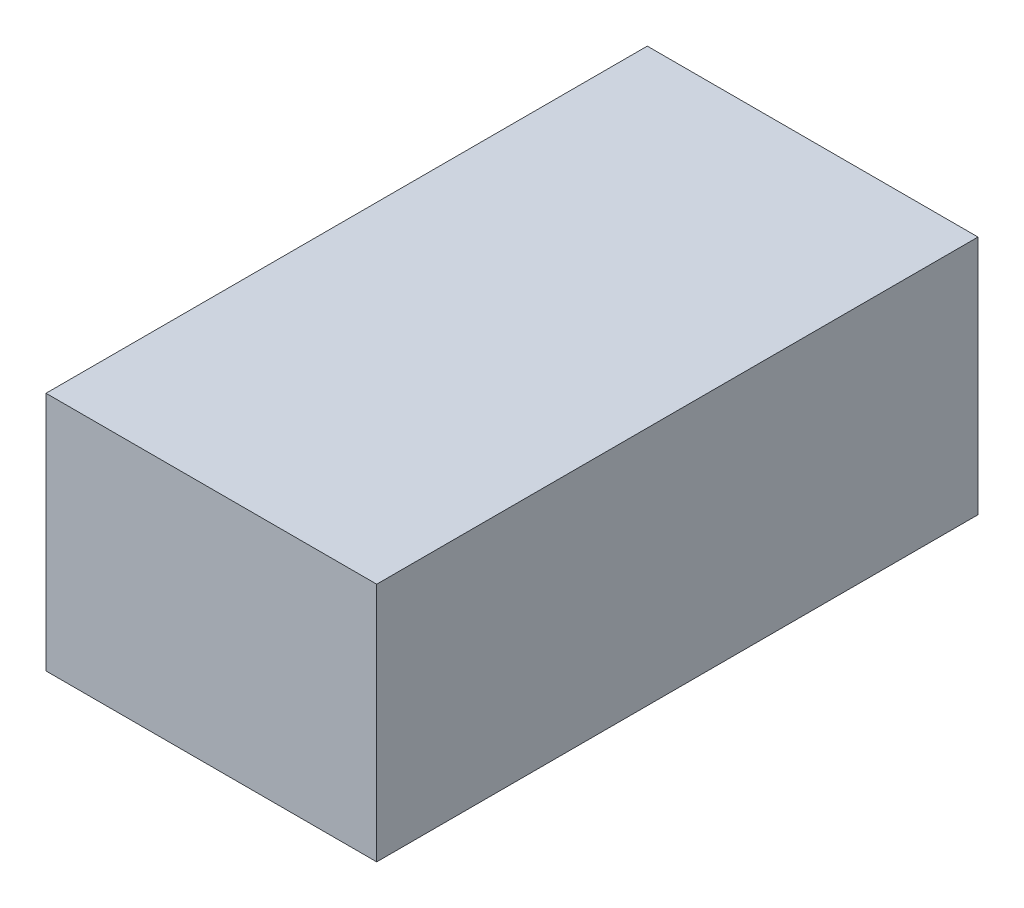
ISO-10303-21;
HEADER;
FILE_DESCRIPTION(('STEP AP214'),'2;1');
FILE_NAME('part.step','',(''),(''),'','','');
FILE_SCHEMA(('AUTOMOTIVE_DESIGN { 1 0 10303 214 1 1 1 1 }'));
ENDSEC;
DATA;
#1=APPLICATION_CONTEXT('core data for automotive mechanical design processes');
#2=APPLICATION_PROTOCOL_DEFINITION('international standard','automotive_design',2000,#1);
#3=PRODUCT_CONTEXT('',#1,'mechanical');
#4=PRODUCT('Part','Part','',(#3));
#5=PRODUCT_RELATED_PRODUCT_CATEGORY('part','',(#4));
#6=PRODUCT_DEFINITION_FORMATION('','',#4);
#7=PRODUCT_DEFINITION_CONTEXT('part definition',#1,'design');
#8=PRODUCT_DEFINITION('design','',#6,#7);
#9=PRODUCT_DEFINITION_SHAPE('','',#8);
#10=(LENGTH_UNIT() NAMED_UNIT(*) SI_UNIT(.MILLI.,.METRE.));
#11=(NAMED_UNIT(*) PLANE_ANGLE_UNIT() SI_UNIT($,.RADIAN.));
#12=(NAMED_UNIT(*) SI_UNIT($,.STERADIAN.) SOLID_ANGLE_UNIT());
#13=UNCERTAINTY_MEASURE_WITH_UNIT(LENGTH_MEASURE(1.E-05),#10,'distance_accuracy_value','');
#14=(GEOMETRIC_REPRESENTATION_CONTEXT(3) GLOBAL_UNCERTAINTY_ASSIGNED_CONTEXT((#13)) GLOBAL_UNIT_ASSIGNED_CONTEXT((#10,
#11,#12)) REPRESENTATION_CONTEXT('',''));
#15=CARTESIAN_POINT('',(0.,0.,0.));
#16=DIRECTION('',(0.,0.,1.));
#17=DIRECTION('',(1.,0.,0.));
#18=AXIS2_PLACEMENT_3D('',#15,#16,#17);
#19=CARTESIAN_POINT('',(-5.5,6.,10.));
#20=DIRECTION('',(1.,0.,0.));
#21=DIRECTION('',(0.,1.,0.));
#22=AXIS2_PLACEMENT_3D('',#19,#20,#21);
#23=PLANE('',#22);
#24=DIRECTION('',(0.,-1.,0.));
#25=VECTOR('',#24,1.);
#26=CARTESIAN_POINT('',(-5.5,6.,-10.));
#27=LINE('',#26,#25);
#28=CARTESIAN_POINT('',(-5.5,6.,-10.));
#29=VERTEX_POINT('',#28);
#30=CARTESIAN_POINT('',(-5.5,-2.,-10.));
#31=VERTEX_POINT('',#30);
#32=EDGE_CURVE('E104',#29,#31,#27,.T.);
#33=ORIENTED_EDGE('',*,*,#32,.T.);
#34=DIRECTION('',(0.,0.,-1.));
#35=VECTOR('',#34,1.);
#36=CARTESIAN_POINT('',(-5.5,-2.,10.));
#37=LINE('',#36,#35);
#38=CARTESIAN_POINT('',(-5.5,-2.,10.));
#39=VERTEX_POINT('',#38);
#40=EDGE_CURVE('E46',#39,#31,#37,.T.);
#41=ORIENTED_EDGE('',*,*,#40,.F.);
#42=DIRECTION('',(0.,-1.,0.));
#43=VECTOR('',#42,1.);
#44=CARTESIAN_POINT('',(-5.5,6.,10.));
#45=LINE('',#44,#43);
#46=CARTESIAN_POINT('',(-5.5,6.,10.));
#47=VERTEX_POINT('',#46);
#48=EDGE_CURVE('E88',#47,#39,#45,.T.);
#49=ORIENTED_EDGE('',*,*,#48,.F.);
#50=DIRECTION('',(0.,0.,-1.));
#51=VECTOR('',#50,1.);
#52=CARTESIAN_POINT('',(-5.5,6.,10.));
#53=LINE('',#52,#51);
#54=EDGE_CURVE('E54',#47,#29,#53,.T.);
#55=ORIENTED_EDGE('',*,*,#54,.T.);
#56=EDGE_LOOP('',(#33,#41,#49,#55));
#57=FACE_BOUND('',#56,.T.);
#58=ADVANCED_FACE('F37',(#57),#23,.F.);
#59=CARTESIAN_POINT('',(-5.5,-2.,10.));
#60=DIRECTION('',(0.,1.,0.));
#61=DIRECTION('',(-1.,0.,0.));
#62=AXIS2_PLACEMENT_3D('',#59,#60,#61);
#63=PLANE('',#62);
#64=CARTESIAN_POINT('',(0.,-2.,0.));
#65=DIRECTION('',(0.,1.,0.));
#66=DIRECTION('',(0.,0.,1.));
#67=AXIS2_PLACEMENT_3D('',#64,#65,#66);
#68=CIRCLE('',#67,2.5);
#69=CARTESIAN_POINT('',(0.,-2.,2.5));
#70=VERTEX_POINT('',#69);
#71=EDGE_CURVE('E122',#70,#70,#68,.T.);
#72=ORIENTED_EDGE('',*,*,#71,.T.);
#73=EDGE_LOOP('',(#72));
#74=FACE_BOUND('',#73,.T.);
#75=DIRECTION('',(1.,0.,0.));
#76=VECTOR('',#75,1.);
#77=CARTESIAN_POINT('',(-5.5,-2.,-10.));
#78=LINE('',#77,#76);
#79=CARTESIAN_POINT('',(5.5,-2.,-10.));
#80=VERTEX_POINT('',#79);
#81=EDGE_CURVE('E94',#31,#80,#78,.T.);
#82=ORIENTED_EDGE('',*,*,#81,.T.);
#83=DIRECTION('',(0.,0.,-1.));
#84=VECTOR('',#83,1.);
#85=CARTESIAN_POINT('',(5.5,-2.,10.));
#86=LINE('',#85,#84);
#87=CARTESIAN_POINT('',(5.5,-2.,10.));
#88=VERTEX_POINT('',#87);
#89=EDGE_CURVE('E92',#88,#80,#86,.T.);
#90=ORIENTED_EDGE('',*,*,#89,.F.);
#91=DIRECTION('',(1.,0.,0.));
#92=VECTOR('',#91,1.);
#93=CARTESIAN_POINT('',(-5.5,-2.,10.));
#94=LINE('',#93,#92);
#95=EDGE_CURVE('E80',#39,#88,#94,.T.);
#96=ORIENTED_EDGE('',*,*,#95,.F.);
#97=ORIENTED_EDGE('',*,*,#40,.T.);
#98=EDGE_LOOP('',(#82,#90,#96,#97));
#99=FACE_BOUND('',#98,.T.);
#100=ADVANCED_FACE('F93',(#74,#99),#63,.F.);
#101=CARTESIAN_POINT('',(5.5,6.00000000000001,10.));
#102=DIRECTION('',(1.,0.,0.));
#103=DIRECTION('',(0.,0.,-1.));
#104=AXIS2_PLACEMENT_3D('',#101,#102,#103);
#105=PLANE('',#104);
#106=DIRECTION('',(0.,-1.,0.));
#107=VECTOR('',#106,1.);
#108=CARTESIAN_POINT('',(5.5,6.00000000000001,-10.));
#109=LINE('',#108,#107);
#110=CARTESIAN_POINT('',(5.5,6.00000000000001,-10.));
#111=VERTEX_POINT('',#110);
#112=EDGE_CURVE('E108',#111,#80,#109,.T.);
#113=ORIENTED_EDGE('',*,*,#112,.F.);
#114=DIRECTION('',(0.,0.,-1.));
#115=VECTOR('',#114,1.);
#116=CARTESIAN_POINT('',(5.5,6.00000000000001,10.));
#117=LINE('',#116,#115);
#118=CARTESIAN_POINT('',(5.5,6.00000000000001,10.));
#119=VERTEX_POINT('',#118);
#120=EDGE_CURVE('E68',#119,#111,#117,.T.);
#121=ORIENTED_EDGE('',*,*,#120,.F.);
#122=DIRECTION('',(0.,-1.,0.));
#123=VECTOR('',#122,1.);
#124=CARTESIAN_POINT('',(5.5,6.00000000000001,10.));
#125=LINE('',#124,#123);
#126=EDGE_CURVE('E87',#119,#88,#125,.T.);
#127=ORIENTED_EDGE('',*,*,#126,.T.);
#128=ORIENTED_EDGE('',*,*,#89,.T.);
#129=EDGE_LOOP('',(#113,#121,#127,#128));
#130=FACE_BOUND('',#129,.T.);
#131=ADVANCED_FACE('F98',(#130),#105,.T.);
#132=CARTESIAN_POINT('',(-5.5,6.,10.));
#133=DIRECTION('',(0.,1.,0.));
#134=DIRECTION('',(-1.,0.,0.));
#135=AXIS2_PLACEMENT_3D('',#132,#133,#134);
#136=PLANE('',#135);
#137=DIRECTION('',(1.,0.,0.));
#138=VECTOR('',#137,1.);
#139=CARTESIAN_POINT('',(-5.5,6.,-10.));
#140=LINE('',#139,#138);
#141=EDGE_CURVE('E110',#29,#111,#140,.T.);
#142=ORIENTED_EDGE('',*,*,#141,.F.);
#143=ORIENTED_EDGE('',*,*,#54,.F.);
#144=DIRECTION('',(1.,0.,0.));
#145=VECTOR('',#144,1.);
#146=CARTESIAN_POINT('',(-5.5,6.,10.));
#147=LINE('',#146,#145);
#148=EDGE_CURVE('E99',#47,#119,#147,.T.);
#149=ORIENTED_EDGE('',*,*,#148,.T.);
#150=ORIENTED_EDGE('',*,*,#120,.T.);
#151=EDGE_LOOP('',(#142,#143,#149,#150));
#152=FACE_BOUND('',#151,.T.);
#153=ADVANCED_FACE('F166',(#152),#136,.T.);
#154=CARTESIAN_POINT('',(0.,0.,10.));
#155=DIRECTION('',(0.,0.,1.));
#156=DIRECTION('',(1.,0.,0.));
#157=AXIS2_PLACEMENT_3D('',#154,#155,#156);
#158=PLANE('',#157);
#159=ORIENTED_EDGE('',*,*,#48,.T.);
#160=ORIENTED_EDGE('',*,*,#95,.T.);
#161=ORIENTED_EDGE('',*,*,#126,.F.);
#162=ORIENTED_EDGE('',*,*,#148,.F.);
#163=EDGE_LOOP('',(#159,#160,#161,#162));
#164=FACE_BOUND('',#163,.T.);
#165=ADVANCED_FACE('F84',(#164),#158,.T.);
#166=CARTESIAN_POINT('',(0.,0.,-10.));
#167=DIRECTION('',(0.,0.,1.));
#168=DIRECTION('',(1.,0.,0.));
#169=AXIS2_PLACEMENT_3D('',#166,#167,#168);
#170=PLANE('',#169);
#171=ORIENTED_EDGE('',*,*,#32,.F.);
#172=ORIENTED_EDGE('',*,*,#141,.T.);
#173=ORIENTED_EDGE('',*,*,#112,.T.);
#174=ORIENTED_EDGE('',*,*,#81,.F.);
#175=EDGE_LOOP('',(#171,#172,#173,#174));
#176=FACE_BOUND('',#175,.T.);
#177=ADVANCED_FACE('F145',(#176),#170,.F.);
#178=CARTESIAN_POINT('',(0.,0.,0.));
#179=DIRECTION('',(0.,1.,0.));
#180=DIRECTION('',(0.,0.,1.));
#181=AXIS2_PLACEMENT_3D('',#178,#179,#180);
#182=CYLINDRICAL_SURFACE('',#181,2.5);
#183=ORIENTED_EDGE('',*,*,#71,.F.);
#184=EDGE_LOOP('',(#183));
#185=FACE_BOUND('',#184,.T.);
#186=CARTESIAN_POINT('',(0.,0.,0.));
#187=DIRECTION('',(0.,1.,0.));
#188=DIRECTION('',(0.,0.,1.));
#189=AXIS2_PLACEMENT_3D('',#186,#187,#188);
#190=CIRCLE('',#189,2.5);
#191=CARTESIAN_POINT('',(0.,0.,2.5));
#192=VERTEX_POINT('',#191);
#193=EDGE_CURVE('E117',#192,#192,#190,.T.);
#194=ORIENTED_EDGE('',*,*,#193,.T.);
#195=EDGE_LOOP('',(#194));
#196=FACE_BOUND('',#195,.T.);
#197=ADVANCED_FACE('F141',(#185,#196),#182,.F.);
#198=CARTESIAN_POINT('',(0.,0.,0.));
#199=DIRECTION('',(0.,1.,0.));
#200=DIRECTION('',(0.,0.,1.));
#201=AXIS2_PLACEMENT_3D('',#198,#199,#200);
#202=PLANE('',#201);
#203=CARTESIAN_POINT('',(0.,0.,0.));
#204=DIRECTION('',(0.,1.,0.));
#205=DIRECTION('',(0.,0.,1.));
#206=AXIS2_PLACEMENT_3D('',#203,#204,#205);
#207=CIRCLE('',#206,2.);
#208=CARTESIAN_POINT('',(0.,0.,2.));
#209=VERTEX_POINT('',#208);
#210=EDGE_CURVE('E11',#209,#209,#207,.F.);
#211=ORIENTED_EDGE('',*,*,#210,.F.);
#212=EDGE_LOOP('',(#211));
#213=FACE_BOUND('',#212,.T.);
#214=ORIENTED_EDGE('',*,*,#193,.F.);
#215=EDGE_LOOP('',(#214));
#216=FACE_BOUND('',#215,.T.);
#217=ADVANCED_FACE('F144',(#213,#216),#202,.F.);
#218=CARTESIAN_POINT('',(0.,-1.5,0.));
#219=DIRECTION('',(0.,-1.,0.));
#220=DIRECTION('',(0.,0.,-1.));
#221=AXIS2_PLACEMENT_3D('',#218,#219,#220);
#222=PLANE('',#221);
#223=CARTESIAN_POINT('',(0.,-1.5,0.));
#224=DIRECTION('',(0.,-1.,0.));
#225=DIRECTION('',(0.,0.,-1.));
#226=AXIS2_PLACEMENT_3D('',#223,#224,#225);
#227=CIRCLE('',#226,2.);
#228=CARTESIAN_POINT('',(0.,-1.5,-2.));
#229=VERTEX_POINT('',#228);
#230=EDGE_CURVE('E125',#229,#229,#227,.T.);
#231=ORIENTED_EDGE('',*,*,#230,.T.);
#232=EDGE_LOOP('',(#231));
#233=FACE_BOUND('',#232,.T.);
#234=ADVANCED_FACE('F150',(#233),#222,.T.);
#235=CARTESIAN_POINT('',(0.,0.,0.));
#236=DIRECTION('',(0.,-1.,0.));
#237=DIRECTION('',(0.,0.,-1.));
#238=AXIS2_PLACEMENT_3D('',#235,#236,#237);
#239=CYLINDRICAL_SURFACE('',#238,2.);
#240=ORIENTED_EDGE('',*,*,#230,.F.);
#241=EDGE_LOOP('',(#240));
#242=FACE_BOUND('',#241,.T.);
#243=ORIENTED_EDGE('',*,*,#210,.T.);
#244=EDGE_LOOP('',(#243));
#245=FACE_BOUND('',#244,.T.);
#246=ADVANCED_FACE('F156',(#242,#245),#239,.T.);
#247=CLOSED_SHELL('',(#58,#100,#131,#153,#165,#177,#197,#217,#234,#246));
#248=CARTESIAN_POINT('',(0.,1.,0.));
#249=DIRECTION('',(0.,1.,0.));
#250=DIRECTION('',(0.,0.,1.));
#251=AXIS2_PLACEMENT_3D('',#248,#249,#250);
#252=PLANE('',#251);
#253=CARTESIAN_POINT('',(0.,1.,0.));
#254=DIRECTION('',(0.,1.,0.));
#255=DIRECTION('',(0.,0.,1.));
#256=AXIS2_PLACEMENT_3D('',#253,#254,#255);
#257=CIRCLE('',#256,1.3);
#258=CARTESIAN_POINT('',(0.,1.,1.3));
#259=VERTEX_POINT('',#258);
#260=EDGE_CURVE('E115',#259,#259,#257,.T.);
#261=ORIENTED_EDGE('',*,*,#260,.T.);
#262=EDGE_LOOP('',(#261));
#263=FACE_BOUND('',#262,.T.);
#264=CARTESIAN_POINT('',(0.,1.,0.));
#265=DIRECTION('',(0.,1.,0.));
#266=DIRECTION('',(0.,0.,1.));
#267=AXIS2_PLACEMENT_3D('',#264,#265,#266);
#268=CIRCLE('',#267,1.8);
#269=CARTESIAN_POINT('',(0.,1.,1.8));
#270=VERTEX_POINT('',#269);
#271=EDGE_CURVE('E106',#270,#270,#268,.T.);
#272=ORIENTED_EDGE('',*,*,#271,.F.);
#273=EDGE_LOOP('',(#272));
#274=FACE_BOUND('',#273,.T.);
#275=ADVANCED_FACE('F199',(#263,#274),#252,.F.);
#276=CARTESIAN_POINT('',(0.,0.,0.));
#277=DIRECTION('',(0.,1.,0.));
#278=DIRECTION('',(0.,0.,1.));
#279=AXIS2_PLACEMENT_3D('',#276,#277,#278);
#280=CYLINDRICAL_SURFACE('',#279,1.8);
#281=CARTESIAN_POINT('',(0.,0.,0.));
#282=DIRECTION('',(0.,1.,0.));
#283=DIRECTION('',(0.,0.,1.));
#284=AXIS2_PLACEMENT_3D('',#281,#282,#283);
#285=CIRCLE('',#284,1.8);
#286=CARTESIAN_POINT('',(0.,0.,1.8));
#287=VERTEX_POINT('',#286);
#288=EDGE_CURVE('E132',#287,#287,#285,.T.);
#289=ORIENTED_EDGE('',*,*,#288,.F.);
#290=EDGE_LOOP('',(#289));
#291=FACE_BOUND('',#290,.T.);
#292=ORIENTED_EDGE('',*,*,#271,.T.);
#293=EDGE_LOOP('',(#292));
#294=FACE_BOUND('',#293,.T.);
#295=ADVANCED_FACE('F194',(#291,#294),#280,.F.);
#296=CARTESIAN_POINT('',(0.,0.,0.));
#297=DIRECTION('',(0.,-1.,0.));
#298=DIRECTION('',(0.,0.,-1.));
#299=AXIS2_PLACEMENT_3D('',#296,#297,#298);
#300=CYLINDRICAL_SURFACE('',#299,1.3);
#301=CARTESIAN_POINT('',(0.,0.,0.));
#302=DIRECTION('',(0.,-1.,0.));
#303=DIRECTION('',(0.,0.,-1.));
#304=AXIS2_PLACEMENT_3D('',#301,#302,#303);
#305=CIRCLE('',#304,1.3);
#306=CARTESIAN_POINT('',(0.,0.,-1.3));
#307=VERTEX_POINT('',#306);
#308=EDGE_CURVE('E118',#307,#307,#305,.T.);
#309=ORIENTED_EDGE('',*,*,#308,.F.);
#310=EDGE_LOOP('',(#309));
#311=FACE_BOUND('',#310,.T.);
#312=ORIENTED_EDGE('',*,*,#260,.F.);
#313=EDGE_LOOP('',(#312));
#314=FACE_BOUND('',#313,.T.);
#315=ADVANCED_FACE('F198',(#311,#314),#300,.T.);
#316=CARTESIAN_POINT('',(0.,0.,0.));
#317=DIRECTION('',(0.,-1.,0.));
#318=DIRECTION('',(0.,0.,-1.));
#319=AXIS2_PLACEMENT_3D('',#316,#317,#318);
#320=PLANE('',#319);
#321=ORIENTED_EDGE('',*,*,#308,.T.);
#322=EDGE_LOOP('',(#321));
#323=FACE_BOUND('',#322,.T.);
#324=ORIENTED_EDGE('',*,*,#288,.T.);
#325=EDGE_LOOP('',(#324));
#326=FACE_BOUND('',#325,.T.);
#327=ADVANCED_FACE('F236',(#323,#326),#320,.F.);
#328=CLOSED_SHELL('',(#275,#295,#315,#327));
#329=ORIENTED_CLOSED_SHELL('',*,#328,.T.);
#330=BREP_WITH_VOIDS('B2',#247,(#329));
#331=ADVANCED_BREP_SHAPE_REPRESENTATION('',(#18,#330),#14);
#332=SHAPE_DEFINITION_REPRESENTATION(#9,#331);
ENDSEC;
END-ISO-10303-21;
